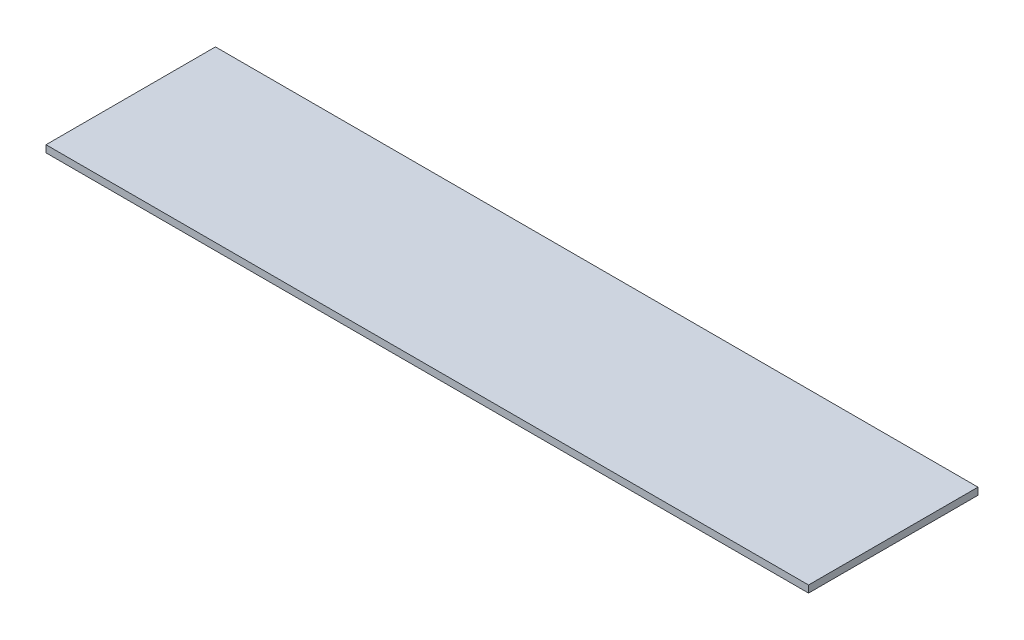
ISO-10303-21;
HEADER;
FILE_DESCRIPTION(('STEP AP214'),'2;1');
FILE_NAME('part.step','',(''),(''),'','','');
FILE_SCHEMA(('AUTOMOTIVE_DESIGN { 1 0 10303 214 1 1 1 1 }'));
ENDSEC;
DATA;
#1=APPLICATION_CONTEXT('core data for automotive mechanical design processes');
#2=APPLICATION_PROTOCOL_DEFINITION('international standard','automotive_design',2000,#1);
#3=PRODUCT_CONTEXT('',#1,'mechanical');
#4=PRODUCT('Part','Part','',(#3));
#5=PRODUCT_RELATED_PRODUCT_CATEGORY('part','',(#4));
#6=PRODUCT_DEFINITION_FORMATION('','',#4);
#7=PRODUCT_DEFINITION_CONTEXT('part definition',#1,'design');
#8=PRODUCT_DEFINITION('design','',#6,#7);
#9=PRODUCT_DEFINITION_SHAPE('','',#8);
#10=(LENGTH_UNIT() NAMED_UNIT(*) SI_UNIT(.MILLI.,.METRE.));
#11=(NAMED_UNIT(*) PLANE_ANGLE_UNIT() SI_UNIT($,.RADIAN.));
#12=(NAMED_UNIT(*) SI_UNIT($,.STERADIAN.) SOLID_ANGLE_UNIT());
#13=UNCERTAINTY_MEASURE_WITH_UNIT(LENGTH_MEASURE(1.E-05),#10,'distance_accuracy_value','');
#14=(GEOMETRIC_REPRESENTATION_CONTEXT(3) GLOBAL_UNCERTAINTY_ASSIGNED_CONTEXT((#13)) GLOBAL_UNIT_ASSIGNED_CONTEXT((#10,
#11,#12)) REPRESENTATION_CONTEXT('',''));
#15=CARTESIAN_POINT('',(0.,0.,0.));
#16=DIRECTION('',(0.,0.,1.));
#17=DIRECTION('',(1.,0.,0.));
#18=AXIS2_PLACEMENT_3D('',#15,#16,#17);
#19=CARTESIAN_POINT('',(-685.8,-12.7,-152.4));
#20=DIRECTION('',(-1.,0.,0.));
#21=DIRECTION('',(0.,0.,1.));
#22=AXIS2_PLACEMENT_3D('',#19,#20,#21);
#23=PLANE('',#22);
#24=DIRECTION('',(0.,0.,1.));
#25=VECTOR('',#24,1.);
#26=CARTESIAN_POINT('',(-685.8,0.,-152.4));
#27=LINE('',#26,#25);
#28=CARTESIAN_POINT('',(-685.8,0.,-152.4));
#29=VERTEX_POINT('',#28);
#30=CARTESIAN_POINT('',(-685.8,0.,152.4));
#31=VERTEX_POINT('',#30);
#32=EDGE_CURVE('E101',#29,#31,#27,.T.);
#33=ORIENTED_EDGE('',*,*,#32,.F.);
#34=DIRECTION('',(0.,1.,0.));
#35=VECTOR('',#34,1.);
#36=CARTESIAN_POINT('',(-685.8,-12.7,-152.4));
#37=LINE('',#36,#35);
#38=CARTESIAN_POINT('',(-685.8,-12.7,-152.4));
#39=VERTEX_POINT('',#38);
#40=EDGE_CURVE('E11',#39,#29,#37,.T.);
#41=ORIENTED_EDGE('',*,*,#40,.F.);
#42=DIRECTION('',(0.,0.,1.));
#43=VECTOR('',#42,1.);
#44=CARTESIAN_POINT('',(-685.8,-12.7,-152.4));
#45=LINE('',#44,#43);
#46=CARTESIAN_POINT('',(-685.8,-12.7,152.4));
#47=VERTEX_POINT('',#46);
#48=EDGE_CURVE('E95',#39,#47,#45,.T.);
#49=ORIENTED_EDGE('',*,*,#48,.T.);
#50=DIRECTION('',(0.,1.,0.));
#51=VECTOR('',#50,1.);
#52=CARTESIAN_POINT('',(-685.8,-12.7,152.4));
#53=LINE('',#52,#51);
#54=EDGE_CURVE('E40',#47,#31,#53,.T.);
#55=ORIENTED_EDGE('',*,*,#54,.T.);
#56=EDGE_LOOP('',(#33,#41,#49,#55));
#57=FACE_BOUND('',#56,.T.);
#58=ADVANCED_FACE('F37',(#57),#23,.T.);
#59=CARTESIAN_POINT('',(-685.8,-12.7,-152.4));
#60=DIRECTION('',(0.,0.,-1.));
#61=DIRECTION('',(-1.,0.,0.));
#62=AXIS2_PLACEMENT_3D('',#59,#60,#61);
#63=PLANE('',#62);
#64=DIRECTION('',(-1.,0.,0.));
#65=VECTOR('',#64,1.);
#66=CARTESIAN_POINT('',(-685.8,0.,-152.4));
#67=LINE('',#66,#65);
#68=CARTESIAN_POINT('',(685.8,0.,-152.4));
#69=VERTEX_POINT('',#68);
#70=EDGE_CURVE('E97',#69,#29,#67,.T.);
#71=ORIENTED_EDGE('',*,*,#70,.F.);
#72=DIRECTION('',(0.,1.,0.));
#73=VECTOR('',#72,1.);
#74=CARTESIAN_POINT('',(685.8,-12.7,-152.4));
#75=LINE('',#74,#73);
#76=CARTESIAN_POINT('',(685.8,-12.7,-152.4));
#77=VERTEX_POINT('',#76);
#78=EDGE_CURVE('E46',#77,#69,#75,.T.);
#79=ORIENTED_EDGE('',*,*,#78,.F.);
#80=DIRECTION('',(-1.,0.,0.));
#81=VECTOR('',#80,1.);
#82=CARTESIAN_POINT('',(-685.8,-12.7,-152.4));
#83=LINE('',#82,#81);
#84=EDGE_CURVE('E92',#77,#39,#83,.T.);
#85=ORIENTED_EDGE('',*,*,#84,.T.);
#86=ORIENTED_EDGE('',*,*,#40,.T.);
#87=EDGE_LOOP('',(#71,#79,#85,#86));
#88=FACE_BOUND('',#87,.T.);
#89=ADVANCED_FACE('F111',(#88),#63,.T.);
#90=CARTESIAN_POINT('',(685.8,-12.7,-152.4));
#91=DIRECTION('',(1.,0.,0.));
#92=DIRECTION('',(0.,0.,-1.));
#93=AXIS2_PLACEMENT_3D('',#90,#91,#92);
#94=PLANE('',#93);
#95=DIRECTION('',(0.,0.,-1.));
#96=VECTOR('',#95,1.);
#97=CARTESIAN_POINT('',(685.8,0.,-152.4));
#98=LINE('',#97,#96);
#99=CARTESIAN_POINT('',(685.8,0.,152.4));
#100=VERTEX_POINT('',#99);
#101=EDGE_CURVE('E87',#100,#69,#98,.T.);
#102=ORIENTED_EDGE('',*,*,#101,.F.);
#103=DIRECTION('',(0.,1.,0.));
#104=VECTOR('',#103,1.);
#105=CARTESIAN_POINT('',(685.8,-12.7,152.4));
#106=LINE('',#105,#104);
#107=CARTESIAN_POINT('',(685.8,-12.7,152.4));
#108=VERTEX_POINT('',#107);
#109=EDGE_CURVE('E82',#108,#100,#106,.T.);
#110=ORIENTED_EDGE('',*,*,#109,.F.);
#111=DIRECTION('',(0.,0.,-1.));
#112=VECTOR('',#111,1.);
#113=CARTESIAN_POINT('',(685.8,-12.7,-152.4));
#114=LINE('',#113,#112);
#115=EDGE_CURVE('E85',#108,#77,#114,.T.);
#116=ORIENTED_EDGE('',*,*,#115,.T.);
#117=ORIENTED_EDGE('',*,*,#78,.T.);
#118=EDGE_LOOP('',(#102,#110,#116,#117));
#119=FACE_BOUND('',#118,.T.);
#120=ADVANCED_FACE('F84',(#119),#94,.T.);
#121=CARTESIAN_POINT('',(-685.8,-12.7,152.4));
#122=DIRECTION('',(0.,0.,1.));
#123=DIRECTION('',(1.,0.,0.));
#124=AXIS2_PLACEMENT_3D('',#121,#122,#123);
#125=PLANE('',#124);
#126=DIRECTION('',(1.,0.,0.));
#127=VECTOR('',#126,1.);
#128=CARTESIAN_POINT('',(-685.8,0.,152.4));
#129=LINE('',#128,#127);
#130=EDGE_CURVE('E104',#31,#100,#129,.T.);
#131=ORIENTED_EDGE('',*,*,#130,.F.);
#132=ORIENTED_EDGE('',*,*,#54,.F.);
#133=DIRECTION('',(1.,0.,0.));
#134=VECTOR('',#133,1.);
#135=CARTESIAN_POINT('',(-685.8,-12.7,152.4));
#136=LINE('',#135,#134);
#137=EDGE_CURVE('E91',#47,#108,#136,.T.);
#138=ORIENTED_EDGE('',*,*,#137,.T.);
#139=ORIENTED_EDGE('',*,*,#109,.T.);
#140=EDGE_LOOP('',(#131,#132,#138,#139));
#141=FACE_BOUND('',#140,.T.);
#142=ADVANCED_FACE('F94',(#141),#125,.T.);
#143=CARTESIAN_POINT('',(-685.8,-12.7,152.4));
#144=DIRECTION('',(0.,1.,0.));
#145=DIRECTION('',(0.,0.,1.));
#146=AXIS2_PLACEMENT_3D('',#143,#144,#145);
#147=PLANE('',#146);
#148=ORIENTED_EDGE('',*,*,#48,.F.);
#149=ORIENTED_EDGE('',*,*,#84,.F.);
#150=ORIENTED_EDGE('',*,*,#115,.F.);
#151=ORIENTED_EDGE('',*,*,#137,.F.);
#152=EDGE_LOOP('',(#148,#149,#150,#151));
#153=FACE_BOUND('',#152,.T.);
#154=ADVANCED_FACE('F90',(#153),#147,.F.);
#155=CARTESIAN_POINT('',(-685.8,0.,152.4));
#156=DIRECTION('',(0.,1.,0.));
#157=DIRECTION('',(0.,0.,1.));
#158=AXIS2_PLACEMENT_3D('',#155,#156,#157);
#159=PLANE('',#158);
#160=ORIENTED_EDGE('',*,*,#32,.T.);
#161=ORIENTED_EDGE('',*,*,#130,.T.);
#162=ORIENTED_EDGE('',*,*,#101,.T.);
#163=ORIENTED_EDGE('',*,*,#70,.T.);
#164=EDGE_LOOP('',(#160,#161,#162,#163));
#165=FACE_BOUND('',#164,.T.);
#166=ADVANCED_FACE('F110',(#165),#159,.T.);
#167=CLOSED_SHELL('',(#58,#89,#120,#142,#154,#166));
#168=MANIFOLD_SOLID_BREP('B2',#167);
#169=ADVANCED_BREP_SHAPE_REPRESENTATION('',(#18,#168),#14);
#170=SHAPE_DEFINITION_REPRESENTATION(#9,#169);
ENDSEC;
END-ISO-10303-21;
